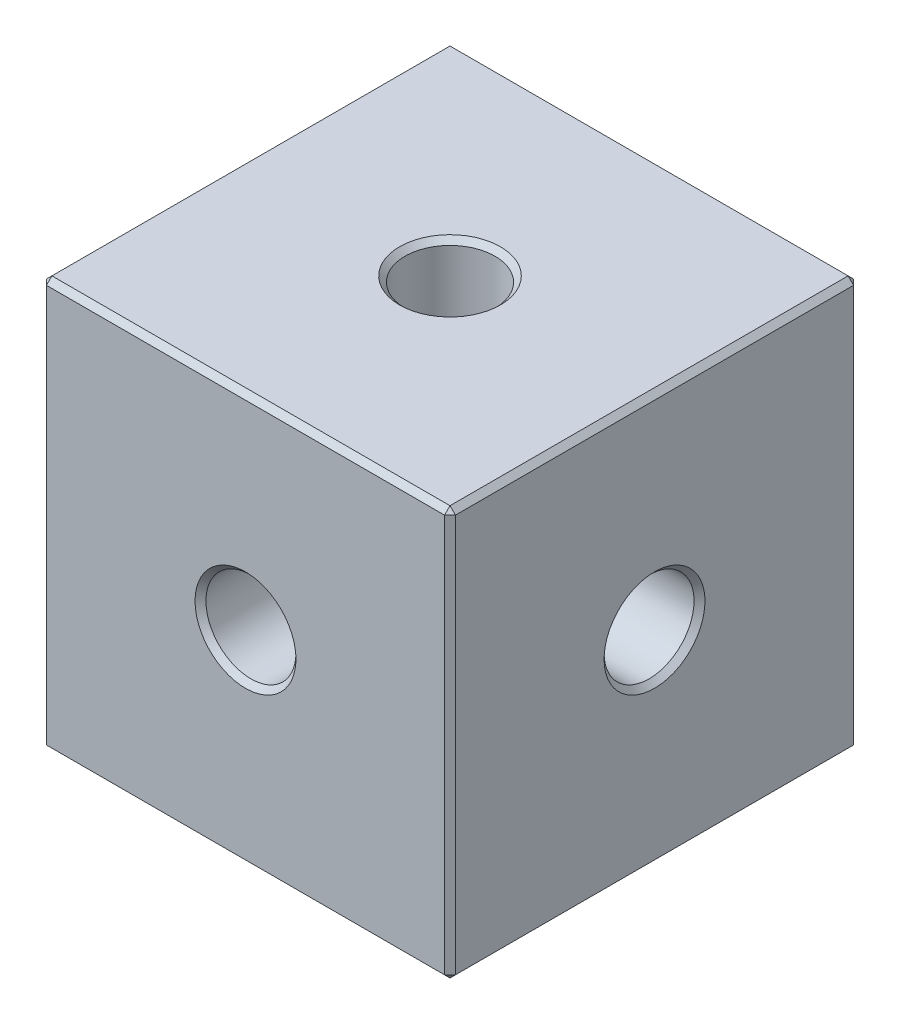
ISO-10303-21;
HEADER;
FILE_DESCRIPTION(('STEP AP214'),'2;1');
FILE_NAME('part.step','',(''),(''),'','','');
FILE_SCHEMA(('AUTOMOTIVE_DESIGN { 1 0 10303 214 1 1 1 1 }'));
ENDSEC;
DATA;
#1=APPLICATION_CONTEXT('core data for automotive mechanical design processes');
#2=APPLICATION_PROTOCOL_DEFINITION('international standard','automotive_design',2000,#1);
#3=PRODUCT_CONTEXT('',#1,'mechanical');
#4=PRODUCT('Part','Part','',(#3));
#5=PRODUCT_RELATED_PRODUCT_CATEGORY('part','',(#4));
#6=PRODUCT_DEFINITION_FORMATION('','',#4);
#7=PRODUCT_DEFINITION_CONTEXT('part definition',#1,'design');
#8=PRODUCT_DEFINITION('design','',#6,#7);
#9=PRODUCT_DEFINITION_SHAPE('','',#8);
#10=(LENGTH_UNIT() NAMED_UNIT(*) SI_UNIT(.MILLI.,.METRE.));
#11=(NAMED_UNIT(*) PLANE_ANGLE_UNIT() SI_UNIT($,.RADIAN.));
#12=(NAMED_UNIT(*) SI_UNIT($,.STERADIAN.) SOLID_ANGLE_UNIT());
#13=UNCERTAINTY_MEASURE_WITH_UNIT(LENGTH_MEASURE(1.E-05),#10,'distance_accuracy_value','');
#14=(GEOMETRIC_REPRESENTATION_CONTEXT(3) GLOBAL_UNCERTAINTY_ASSIGNED_CONTEXT((#13)) GLOBAL_UNIT_ASSIGNED_CONTEXT((#10,
#11,#12)) REPRESENTATION_CONTEXT('',''));
#15=CARTESIAN_POINT('',(0.,0.,0.));
#16=DIRECTION('',(0.,0.,1.));
#17=DIRECTION('',(1.,0.,0.));
#18=AXIS2_PLACEMENT_3D('',#15,#16,#17);
#19=CARTESIAN_POINT('',(0.,0.,7.5));
#20=DIRECTION('',(0.,0.,1.));
#21=DIRECTION('',(1.,0.,0.));
#22=AXIS2_PLACEMENT_3D('',#19,#20,#21);
#23=CYLINDRICAL_SURFACE('',#22,1.65);
#24=CARTESIAN_POINT('',(0.,0.,7.3));
#25=DIRECTION('',(0.,0.,-1.));
#26=DIRECTION('',(-1.,0.,0.));
#27=AXIS2_PLACEMENT_3D('',#24,#25,#26);
#28=CIRCLE('',#27,1.65);
#29=CARTESIAN_POINT('',(-1.65,0.,7.3));
#30=VERTEX_POINT('',#29);
#31=EDGE_CURVE('E251',#30,#30,#28,.F.);
#32=ORIENTED_EDGE('',*,*,#31,.T.);
#33=EDGE_LOOP('',(#32));
#34=FACE_BOUND('',#33,.T.);
#35=CARTESIAN_POINT('',(0.,0.,0.));
#36=DIRECTION('',(0.,0.707106781186547,0.707106781186547));
#37=DIRECTION('',(0.,-0.707106781186547,0.707106781186547));
#38=AXIS2_PLACEMENT_3D('',#35,#36,#37);
#39=ELLIPSE('',#38,2.3334523779156,1.65);
#40=CARTESIAN_POINT('',(1.1667261889578,-1.1667261889578,1.1667261889578));
#41=VERTEX_POINT('',#40);
#42=CARTESIAN_POINT('',(-1.1667261889578,-1.1667261889578,1.1667261889578));
#43=VERTEX_POINT('',#42);
#44=EDGE_CURVE('E167',#41,#43,#39,.F.);
#45=ORIENTED_EDGE('',*,*,#44,.T.);
#46=CARTESIAN_POINT('',(0.,0.,0.));
#47=DIRECTION('',(0.707106781186548,0.,0.707106781186547));
#48=DIRECTION('',(-0.707106781186547,0.,0.707106781186547));
#49=AXIS2_PLACEMENT_3D('',#46,#47,#48);
#50=ELLIPSE('',#49,2.3334523779156,1.65);
#51=CARTESIAN_POINT('',(-1.1667261889578,1.1667261889578,1.1667261889578));
#52=VERTEX_POINT('',#51);
#53=EDGE_CURVE('E161',#43,#52,#50,.F.);
#54=ORIENTED_EDGE('',*,*,#53,.T.);
#55=CARTESIAN_POINT('',(0.,0.,0.));
#56=DIRECTION('',(0.,-0.707106781186547,0.707106781186547));
#57=DIRECTION('',(0.,0.707106781186547,0.707106781186547));
#58=AXIS2_PLACEMENT_3D('',#55,#56,#57);
#59=ELLIPSE('',#58,2.3334523779156,1.65);
#60=CARTESIAN_POINT('',(1.1667261889578,1.1667261889578,1.1667261889578));
#61=VERTEX_POINT('',#60);
#62=EDGE_CURVE('E181',#52,#61,#59,.F.);
#63=ORIENTED_EDGE('',*,*,#62,.T.);
#64=CARTESIAN_POINT('',(0.,0.,0.));
#65=DIRECTION('',(-0.707106781186547,0.,0.707106781186547));
#66=DIRECTION('',(0.707106781186548,0.,0.707106781186547));
#67=AXIS2_PLACEMENT_3D('',#64,#65,#66);
#68=ELLIPSE('',#67,2.3334523779156,1.65);
#69=EDGE_CURVE('E618',#61,#41,#68,.F.);
#70=ORIENTED_EDGE('',*,*,#69,.T.);
#71=EDGE_LOOP('',(#45,#54,#63,#70));
#72=FACE_BOUND('',#71,.T.);
#73=ADVANCED_FACE('F41',(#34,#72),#23,.F.);
#74=CARTESIAN_POINT('',(7.5,7.5,-7.5));
#75=DIRECTION('',(-1.,0.,0.));
#76=DIRECTION('',(0.,0.,1.));
#77=AXIS2_PLACEMENT_3D('',#74,#75,#76);
#78=PLANE('',#77);
#79=CARTESIAN_POINT('',(7.5,0.,0.));
#80=DIRECTION('',(-1.,0.,0.));
#81=DIRECTION('',(0.,0.,1.));
#82=AXIS2_PLACEMENT_3D('',#79,#80,#81);
#83=CIRCLE('',#82,1.85);
#84=CARTESIAN_POINT('',(7.5,0.,1.85));
#85=VERTEX_POINT('',#84);
#86=EDGE_CURVE('E248',#85,#85,#83,.T.);
#87=ORIENTED_EDGE('',*,*,#86,.T.);
#88=EDGE_LOOP('',(#87));
#89=FACE_BOUND('',#88,.T.);
#90=DIRECTION('',(0.,0.,-1.));
#91=VECTOR('',#90,1.);
#92=CARTESIAN_POINT('',(7.5,-7.29999999999999,-7.5));
#93=LINE('',#92,#91);
#94=CARTESIAN_POINT('',(7.5,-7.29999999999999,7.29999999999999));
#95=VERTEX_POINT('',#94);
#96=CARTESIAN_POINT('',(7.5,-7.29999999999999,-7.29999999999999));
#97=VERTEX_POINT('',#96);
#98=EDGE_CURVE('E243',#95,#97,#93,.T.);
#99=ORIENTED_EDGE('',*,*,#98,.T.);
#100=DIRECTION('',(0.,1.,0.));
#101=VECTOR('',#100,1.);
#102=CARTESIAN_POINT('',(7.5,7.5,-7.29999999999999));
#103=LINE('',#102,#101);
#104=CARTESIAN_POINT('',(7.5,7.29999999999999,-7.29999999999999));
#105=VERTEX_POINT('',#104);
#106=EDGE_CURVE('E245',#97,#105,#103,.T.);
#107=ORIENTED_EDGE('',*,*,#106,.T.);
#108=DIRECTION('',(0.,0.,1.));
#109=VECTOR('',#108,1.);
#110=CARTESIAN_POINT('',(7.5,7.29999999999999,7.5));
#111=LINE('',#110,#109);
#112=CARTESIAN_POINT('',(7.5,7.29999999999999,7.29999999999999));
#113=VERTEX_POINT('',#112);
#114=EDGE_CURVE('E239',#105,#113,#111,.T.);
#115=ORIENTED_EDGE('',*,*,#114,.T.);
#116=DIRECTION('',(0.,-1.,0.));
#117=VECTOR('',#116,1.);
#118=CARTESIAN_POINT('',(7.5,7.5,7.29999999999999));
#119=LINE('',#118,#117);
#120=EDGE_CURVE('E241',#113,#95,#119,.T.);
#121=ORIENTED_EDGE('',*,*,#120,.T.);
#122=EDGE_LOOP('',(#99,#107,#115,#121));
#123=FACE_BOUND('',#122,.T.);
#124=ADVANCED_FACE('F352',(#89,#123),#78,.F.);
#125=CARTESIAN_POINT('',(-7.5,7.5,-7.5));
#126=DIRECTION('',(0.,0.,1.));
#127=DIRECTION('',(1.,0.,0.));
#128=AXIS2_PLACEMENT_3D('',#125,#126,#127);
#129=PLANE('',#128);
#130=CARTESIAN_POINT('',(0.,0.,-7.5));
#131=DIRECTION('',(0.,0.,1.));
#132=DIRECTION('',(1.,0.,0.));
#133=AXIS2_PLACEMENT_3D('',#130,#131,#132);
#134=CIRCLE('',#133,1.85);
#135=CARTESIAN_POINT('',(1.85,0.,-7.5));
#136=VERTEX_POINT('',#135);
#137=EDGE_CURVE('E230',#136,#136,#134,.T.);
#138=ORIENTED_EDGE('',*,*,#137,.T.);
#139=EDGE_LOOP('',(#138));
#140=FACE_BOUND('',#139,.T.);
#141=DIRECTION('',(-1.,0.,0.));
#142=VECTOR('',#141,1.);
#143=CARTESIAN_POINT('',(-7.5,-7.29999999999999,-7.5));
#144=LINE('',#143,#142);
#145=CARTESIAN_POINT('',(7.29999999999999,-7.29999999999999,-7.5));
#146=VERTEX_POINT('',#145);
#147=CARTESIAN_POINT('',(-7.3,-7.29999999999999,-7.5));
#148=VERTEX_POINT('',#147);
#149=EDGE_CURVE('E225',#146,#148,#144,.T.);
#150=ORIENTED_EDGE('',*,*,#149,.T.);
#151=DIRECTION('',(0.,1.,0.));
#152=VECTOR('',#151,1.);
#153=CARTESIAN_POINT('',(-7.3,7.5,-7.5));
#154=LINE('',#153,#152);
#155=CARTESIAN_POINT('',(-7.3,7.29999999999999,-7.5));
#156=VERTEX_POINT('',#155);
#157=EDGE_CURVE('E227',#148,#156,#154,.T.);
#158=ORIENTED_EDGE('',*,*,#157,.T.);
#159=DIRECTION('',(1.,0.,0.));
#160=VECTOR('',#159,1.);
#161=CARTESIAN_POINT('',(7.5,7.29999999999999,-7.5));
#162=LINE('',#161,#160);
#163=CARTESIAN_POINT('',(7.29999999999999,7.29999999999999,-7.5));
#164=VERTEX_POINT('',#163);
#165=EDGE_CURVE('E221',#156,#164,#162,.T.);
#166=ORIENTED_EDGE('',*,*,#165,.T.);
#167=DIRECTION('',(0.,-1.,0.));
#168=VECTOR('',#167,1.);
#169=CARTESIAN_POINT('',(7.29999999999999,7.5,-7.5));
#170=LINE('',#169,#168);
#171=EDGE_CURVE('E223',#164,#146,#170,.T.);
#172=ORIENTED_EDGE('',*,*,#171,.T.);
#173=EDGE_LOOP('',(#150,#158,#166,#172));
#174=FACE_BOUND('',#173,.T.);
#175=ADVANCED_FACE('F373',(#140,#174),#129,.F.);
#176=CARTESIAN_POINT('',(-7.5,7.5,-7.5));
#177=DIRECTION('',(1.,0.,0.));
#178=DIRECTION('',(0.,0.,-1.));
#179=AXIS2_PLACEMENT_3D('',#176,#177,#178);
#180=PLANE('',#179);
#181=CARTESIAN_POINT('',(-7.5,0.,0.));
#182=DIRECTION('',(1.,0.,0.));
#183=DIRECTION('',(0.,0.,-1.));
#184=AXIS2_PLACEMENT_3D('',#181,#182,#183);
#185=CIRCLE('',#184,1.84999999999999);
#186=CARTESIAN_POINT('',(-7.5,0.,-1.84999999999999));
#187=VERTEX_POINT('',#186);
#188=EDGE_CURVE('E215',#187,#187,#185,.T.);
#189=ORIENTED_EDGE('',*,*,#188,.T.);
#190=EDGE_LOOP('',(#189));
#191=FACE_BOUND('',#190,.T.);
#192=DIRECTION('',(0.,-1.,0.));
#193=VECTOR('',#192,1.);
#194=CARTESIAN_POINT('',(-7.5,7.5,-7.29999999999999));
#195=LINE('',#194,#193);
#196=CARTESIAN_POINT('',(-7.5,7.29999999999999,-7.29999999999999));
#197=VERTEX_POINT('',#196);
#198=CARTESIAN_POINT('',(-7.5,-7.29999999999999,-7.29999999999999));
#199=VERTEX_POINT('',#198);
#200=EDGE_CURVE('E210',#197,#199,#195,.T.);
#201=ORIENTED_EDGE('',*,*,#200,.T.);
#202=DIRECTION('',(0.,0.,1.));
#203=VECTOR('',#202,1.);
#204=CARTESIAN_POINT('',(-7.5,-7.29999999999999,-7.5));
#205=LINE('',#204,#203);
#206=CARTESIAN_POINT('',(-7.5,-7.29999999999999,7.29999999999999));
#207=VERTEX_POINT('',#206);
#208=EDGE_CURVE('E212',#199,#207,#205,.T.);
#209=ORIENTED_EDGE('',*,*,#208,.T.);
#210=DIRECTION('',(0.,1.,0.));
#211=VECTOR('',#210,1.);
#212=CARTESIAN_POINT('',(-7.5,7.5,7.29999999999999));
#213=LINE('',#212,#211);
#214=CARTESIAN_POINT('',(-7.5,7.29999999999999,7.29999999999999));
#215=VERTEX_POINT('',#214);
#216=EDGE_CURVE('E208',#207,#215,#213,.T.);
#217=ORIENTED_EDGE('',*,*,#216,.T.);
#218=DIRECTION('',(0.,0.,-1.));
#219=VECTOR('',#218,1.);
#220=CARTESIAN_POINT('',(-7.5,7.29999999999999,-7.5));
#221=LINE('',#220,#219);
#222=EDGE_CURVE('E206',#215,#197,#221,.T.);
#223=ORIENTED_EDGE('',*,*,#222,.T.);
#224=EDGE_LOOP('',(#201,#209,#217,#223));
#225=FACE_BOUND('',#224,.T.);
#226=ADVANCED_FACE('F434',(#191,#225),#180,.F.);
#227=CARTESIAN_POINT('',(-7.5,7.5,7.5));
#228=DIRECTION('',(0.,0.,-1.));
#229=DIRECTION('',(-1.,0.,0.));
#230=AXIS2_PLACEMENT_3D('',#227,#228,#229);
#231=PLANE('',#230);
#232=CARTESIAN_POINT('',(0.,0.,7.5));
#233=DIRECTION('',(0.,0.,-1.));
#234=DIRECTION('',(-1.,0.,0.));
#235=AXIS2_PLACEMENT_3D('',#232,#233,#234);
#236=CIRCLE('',#235,1.85);
#237=CARTESIAN_POINT('',(-1.85,0.,7.5));
#238=VERTEX_POINT('',#237);
#239=EDGE_CURVE('E263',#238,#238,#236,.T.);
#240=ORIENTED_EDGE('',*,*,#239,.T.);
#241=EDGE_LOOP('',(#240));
#242=FACE_BOUND('',#241,.T.);
#243=DIRECTION('',(-1.,0.,0.));
#244=VECTOR('',#243,1.);
#245=CARTESIAN_POINT('',(-7.5,7.29999999999999,7.5));
#246=LINE('',#245,#244);
#247=CARTESIAN_POINT('',(7.29999999999999,7.29999999999999,7.5));
#248=VERTEX_POINT('',#247);
#249=CARTESIAN_POINT('',(-7.29999999999999,7.29999999999999,7.5));
#250=VERTEX_POINT('',#249);
#251=EDGE_CURVE('E254',#248,#250,#246,.T.);
#252=ORIENTED_EDGE('',*,*,#251,.T.);
#253=DIRECTION('',(0.,-1.,0.));
#254=VECTOR('',#253,1.);
#255=CARTESIAN_POINT('',(-7.29999999999999,7.5,7.5));
#256=LINE('',#255,#254);
#257=CARTESIAN_POINT('',(-7.29999999999999,-7.29999999999999,7.5));
#258=VERTEX_POINT('',#257);
#259=EDGE_CURVE('E260',#250,#258,#256,.T.);
#260=ORIENTED_EDGE('',*,*,#259,.T.);
#261=DIRECTION('',(1.,0.,0.));
#262=VECTOR('',#261,1.);
#263=CARTESIAN_POINT('',(-7.5,-7.29999999999999,7.5));
#264=LINE('',#263,#262);
#265=CARTESIAN_POINT('',(7.29999999999999,-7.29999999999999,7.5));
#266=VERTEX_POINT('',#265);
#267=EDGE_CURVE('E258',#258,#266,#264,.T.);
#268=ORIENTED_EDGE('',*,*,#267,.T.);
#269=DIRECTION('',(0.,1.,0.));
#270=VECTOR('',#269,1.);
#271=CARTESIAN_POINT('',(7.29999999999999,7.5,7.5));
#272=LINE('',#271,#270);
#273=EDGE_CURVE('E256',#266,#248,#272,.T.);
#274=ORIENTED_EDGE('',*,*,#273,.T.);
#275=EDGE_LOOP('',(#252,#260,#268,#274));
#276=FACE_BOUND('',#275,.T.);
#277=ADVANCED_FACE('F439',(#242,#276),#231,.F.);
#278=CARTESIAN_POINT('',(0.,7.5,0.));
#279=DIRECTION('',(0.,1.,0.));
#280=DIRECTION('',(0.,0.,1.));
#281=AXIS2_PLACEMENT_3D('',#278,#279,#280);
#282=PLANE('',#281);
#283=DIRECTION('',(0.,0.,1.));
#284=VECTOR('',#283,1.);
#285=CARTESIAN_POINT('',(-7.29999999999999,7.5,7.5));
#286=LINE('',#285,#284);
#287=CARTESIAN_POINT('',(-7.3,7.5,-7.29999999999999));
#288=VERTEX_POINT('',#287);
#289=CARTESIAN_POINT('',(-7.29999999999999,7.5,7.29999999999999));
#290=VERTEX_POINT('',#289);
#291=EDGE_CURVE('E59',#288,#290,#286,.T.);
#292=ORIENTED_EDGE('',*,*,#291,.T.);
#293=DIRECTION('',(1.,0.,0.));
#294=VECTOR('',#293,1.);
#295=CARTESIAN_POINT('',(7.5,7.5,7.29999999999999));
#296=LINE('',#295,#294);
#297=CARTESIAN_POINT('',(7.29999999999999,7.5,7.29999999999999));
#298=VERTEX_POINT('',#297);
#299=EDGE_CURVE('E51',#290,#298,#296,.T.);
#300=ORIENTED_EDGE('',*,*,#299,.T.);
#301=DIRECTION('',(0.,0.,-1.));
#302=VECTOR('',#301,1.);
#303=CARTESIAN_POINT('',(7.29999999999999,7.5,-7.5));
#304=LINE('',#303,#302);
#305=CARTESIAN_POINT('',(7.29999999999999,7.5,-7.29999999999999));
#306=VERTEX_POINT('',#305);
#307=EDGE_CURVE('E269',#298,#306,#304,.T.);
#308=ORIENTED_EDGE('',*,*,#307,.T.);
#309=DIRECTION('',(-1.,0.,0.));
#310=VECTOR('',#309,1.);
#311=CARTESIAN_POINT('',(-7.5,7.5,-7.29999999999999));
#312=LINE('',#311,#310);
#313=EDGE_CURVE('E64',#306,#288,#312,.T.);
#314=ORIENTED_EDGE('',*,*,#313,.T.);
#315=EDGE_LOOP('',(#292,#300,#308,#314));
#316=FACE_BOUND('',#315,.T.);
#317=CARTESIAN_POINT('',(0.,7.5,0.));
#318=DIRECTION('',(0.,1.,0.));
#319=DIRECTION('',(0.,0.,1.));
#320=AXIS2_PLACEMENT_3D('',#317,#318,#319);
#321=CIRCLE('',#320,1.85);
#322=CARTESIAN_POINT('',(0.,7.5,1.85));
#323=VERTEX_POINT('',#322);
#324=EDGE_CURVE('E266',#323,#323,#321,.F.);
#325=ORIENTED_EDGE('',*,*,#324,.T.);
#326=EDGE_LOOP('',(#325));
#327=FACE_BOUND('',#326,.T.);
#328=ADVANCED_FACE('F420',(#316,#327),#282,.T.);
#329=CARTESIAN_POINT('',(0.,-7.5,0.));
#330=DIRECTION('',(0.,1.,0.));
#331=DIRECTION('',(0.,0.,1.));
#332=AXIS2_PLACEMENT_3D('',#329,#330,#331);
#333=PLANE('',#332);
#334=CARTESIAN_POINT('',(0.,-7.5,0.));
#335=DIRECTION('',(0.,1.,0.));
#336=DIRECTION('',(0.,0.,1.));
#337=AXIS2_PLACEMENT_3D('',#334,#335,#336);
#338=CIRCLE('',#337,1.85);
#339=CARTESIAN_POINT('',(0.,-7.5,1.85));
#340=VERTEX_POINT('',#339);
#341=EDGE_CURVE('E200',#340,#340,#338,.T.);
#342=ORIENTED_EDGE('',*,*,#341,.T.);
#343=EDGE_LOOP('',(#342));
#344=FACE_BOUND('',#343,.T.);
#345=DIRECTION('',(-1.,0.,0.));
#346=VECTOR('',#345,1.);
#347=CARTESIAN_POINT('',(0.,-7.5,7.29999999999999));
#348=LINE('',#347,#346);
#349=CARTESIAN_POINT('',(7.29999999999999,-7.5,7.29999999999999));
#350=VERTEX_POINT('',#349);
#351=CARTESIAN_POINT('',(-7.29999999999999,-7.5,7.29999999999999));
#352=VERTEX_POINT('',#351);
#353=EDGE_CURVE('E191',#350,#352,#348,.T.);
#354=ORIENTED_EDGE('',*,*,#353,.T.);
#355=DIRECTION('',(0.,0.,-1.));
#356=VECTOR('',#355,1.);
#357=CARTESIAN_POINT('',(-7.3,-7.5,0.));
#358=LINE('',#357,#356);
#359=CARTESIAN_POINT('',(-7.3,-7.5,-7.29999999999999));
#360=VERTEX_POINT('',#359);
#361=EDGE_CURVE('E197',#352,#360,#358,.T.);
#362=ORIENTED_EDGE('',*,*,#361,.T.);
#363=DIRECTION('',(1.,0.,0.));
#364=VECTOR('',#363,1.);
#365=CARTESIAN_POINT('',(0.,-7.5,-7.29999999999999));
#366=LINE('',#365,#364);
#367=CARTESIAN_POINT('',(7.29999999999999,-7.5,-7.29999999999999));
#368=VERTEX_POINT('',#367);
#369=EDGE_CURVE('E195',#360,#368,#366,.T.);
#370=ORIENTED_EDGE('',*,*,#369,.T.);
#371=DIRECTION('',(0.,0.,1.));
#372=VECTOR('',#371,1.);
#373=CARTESIAN_POINT('',(7.29999999999999,-7.5,0.));
#374=LINE('',#373,#372);
#375=EDGE_CURVE('E193',#368,#350,#374,.T.);
#376=ORIENTED_EDGE('',*,*,#375,.T.);
#377=EDGE_LOOP('',(#354,#362,#370,#376));
#378=FACE_BOUND('',#377,.T.);
#379=ADVANCED_FACE('F413',(#344,#378),#333,.F.);
#380=CARTESIAN_POINT('',(0.,0.,-7.3));
#381=DIRECTION('',(0.,0.,1.));
#382=DIRECTION('',(1.,0.,0.));
#383=AXIS2_PLACEMENT_3D('',#380,#381,#382);
#384=CIRCLE('',#383,1.65);
#385=CARTESIAN_POINT('',(1.65,0.,-7.3));
#386=VERTEX_POINT('',#385);
#387=EDGE_CURVE('E233',#386,#386,#384,.F.);
#388=ORIENTED_EDGE('',*,*,#387,.T.);
#389=EDGE_LOOP('',(#388));
#390=FACE_BOUND('',#389,.T.);
#391=CARTESIAN_POINT('',(0.,0.,0.));
#392=DIRECTION('',(0.,-0.707106781186547,0.707106781186547));
#393=DIRECTION('',(0.,0.707106781186547,0.707106781186547));
#394=AXIS2_PLACEMENT_3D('',#391,#392,#393);
#395=ELLIPSE('',#394,2.3334523779156,1.65);
#396=CARTESIAN_POINT('',(-1.1667261889578,-1.1667261889578,-1.1667261889578));
#397=VERTEX_POINT('',#396);
#398=CARTESIAN_POINT('',(1.1667261889578,-1.1667261889578,-1.1667261889578));
#399=VERTEX_POINT('',#398);
#400=EDGE_CURVE('E174',#397,#399,#395,.T.);
#401=ORIENTED_EDGE('',*,*,#400,.T.);
#402=CARTESIAN_POINT('',(0.,0.,0.));
#403=DIRECTION('',(0.707106781186548,0.,0.707106781186547));
#404=DIRECTION('',(-0.707106781186547,0.,0.707106781186547));
#405=AXIS2_PLACEMENT_3D('',#402,#403,#404);
#406=ELLIPSE('',#405,2.3334523779156,1.65);
#407=CARTESIAN_POINT('',(1.1667261889578,1.1667261889578,-1.1667261889578));
#408=VERTEX_POINT('',#407);
#409=EDGE_CURVE('E619',#399,#408,#406,.T.);
#410=ORIENTED_EDGE('',*,*,#409,.T.);
#411=CARTESIAN_POINT('',(0.,0.,0.));
#412=DIRECTION('',(0.,0.707106781186547,0.707106781186547));
#413=DIRECTION('',(0.,-0.707106781186547,0.707106781186547));
#414=AXIS2_PLACEMENT_3D('',#411,#412,#413);
#415=ELLIPSE('',#414,2.3334523779156,1.65);
#416=CARTESIAN_POINT('',(-1.1667261889578,1.1667261889578,-1.1667261889578));
#417=VERTEX_POINT('',#416);
#418=EDGE_CURVE('E176',#408,#417,#415,.T.);
#419=ORIENTED_EDGE('',*,*,#418,.T.);
#420=CARTESIAN_POINT('',(0.,0.,0.));
#421=DIRECTION('',(-0.707106781186547,0.,0.707106781186547));
#422=DIRECTION('',(0.707106781186548,0.,0.707106781186547));
#423=AXIS2_PLACEMENT_3D('',#420,#421,#422);
#424=ELLIPSE('',#423,2.3334523779156,1.65);
#425=EDGE_CURVE('E158',#417,#397,#424,.T.);
#426=ORIENTED_EDGE('',*,*,#425,.T.);
#427=EDGE_LOOP('',(#401,#410,#419,#426));
#428=FACE_BOUND('',#427,.T.);
#429=ADVANCED_FACE('F172',(#390,#428),#23,.F.);
#430=CARTESIAN_POINT('',(0.,7.5,0.));
#431=DIRECTION('',(0.,1.,0.));
#432=DIRECTION('',(0.,0.,1.));
#433=AXIS2_PLACEMENT_3D('',#430,#431,#432);
#434=CYLINDRICAL_SURFACE('',#433,1.65);
#435=CARTESIAN_POINT('',(0.,7.3,0.));
#436=DIRECTION('',(0.,1.,0.));
#437=DIRECTION('',(0.,0.,1.));
#438=AXIS2_PLACEMENT_3D('',#435,#436,#437);
#439=CIRCLE('',#438,1.65);
#440=CARTESIAN_POINT('',(0.,7.3,1.65));
#441=VERTEX_POINT('',#440);
#442=EDGE_CURVE('E11',#441,#441,#439,.T.);
#443=ORIENTED_EDGE('',*,*,#442,.T.);
#444=EDGE_LOOP('',(#443));
#445=FACE_BOUND('',#444,.T.);
#446=ORIENTED_EDGE('',*,*,#62,.F.);
#447=CARTESIAN_POINT('',(0.,0.,0.));
#448=DIRECTION('',(0.707106781186547,0.707106781186547,0.));
#449=DIRECTION('',(-0.707106781186547,0.707106781186547,0.));
#450=AXIS2_PLACEMENT_3D('',#447,#448,#449);
#451=ELLIPSE('',#450,2.3334523779156,1.65);
#452=EDGE_CURVE('E177',#52,#417,#451,.F.);
#453=ORIENTED_EDGE('',*,*,#452,.T.);
#454=ORIENTED_EDGE('',*,*,#418,.F.);
#455=CARTESIAN_POINT('',(0.,0.,0.));
#456=DIRECTION('',(-0.707106781186547,0.707106781186547,0.));
#457=DIRECTION('',(0.707106781186547,0.707106781186547,0.));
#458=AXIS2_PLACEMENT_3D('',#455,#456,#457);
#459=ELLIPSE('',#458,2.3334523779156,1.65);
#460=EDGE_CURVE('E185',#408,#61,#459,.F.);
#461=ORIENTED_EDGE('',*,*,#460,.T.);
#462=EDGE_LOOP('',(#446,#453,#454,#461));
#463=FACE_BOUND('',#462,.T.);
#464=ADVANCED_FACE('F412',(#445,#463),#434,.F.);
#465=CARTESIAN_POINT('',(0.,-7.3,0.));
#466=DIRECTION('',(0.,1.,0.));
#467=DIRECTION('',(0.,0.,1.));
#468=AXIS2_PLACEMENT_3D('',#465,#466,#467);
#469=CIRCLE('',#468,1.65);
#470=CARTESIAN_POINT('',(0.,-7.3,1.65));
#471=VERTEX_POINT('',#470);
#472=EDGE_CURVE('E203',#471,#471,#469,.F.);
#473=ORIENTED_EDGE('',*,*,#472,.T.);
#474=EDGE_LOOP('',(#473));
#475=FACE_BOUND('',#474,.T.);
#476=ORIENTED_EDGE('',*,*,#44,.F.);
#477=CARTESIAN_POINT('',(0.,0.,0.));
#478=DIRECTION('',(0.707106781186547,0.707106781186547,0.));
#479=DIRECTION('',(-0.707106781186547,0.707106781186547,0.));
#480=AXIS2_PLACEMENT_3D('',#477,#478,#479);
#481=ELLIPSE('',#480,2.3334523779156,1.65);
#482=EDGE_CURVE('E166',#41,#399,#481,.T.);
#483=ORIENTED_EDGE('',*,*,#482,.T.);
#484=ORIENTED_EDGE('',*,*,#400,.F.);
#485=CARTESIAN_POINT('',(0.,0.,0.));
#486=DIRECTION('',(-0.707106781186547,0.707106781186547,0.));
#487=DIRECTION('',(0.707106781186547,0.707106781186547,0.));
#488=AXIS2_PLACEMENT_3D('',#485,#486,#487);
#489=ELLIPSE('',#488,2.3334523779156,1.65);
#490=EDGE_CURVE('E155',#397,#43,#489,.T.);
#491=ORIENTED_EDGE('',*,*,#490,.T.);
#492=EDGE_LOOP('',(#476,#483,#484,#491));
#493=FACE_BOUND('',#492,.T.);
#494=ADVANCED_FACE('F180',(#475,#493),#434,.F.);
#495=CARTESIAN_POINT('',(7.5,0.,0.));
#496=DIRECTION('',(1.,0.,0.));
#497=DIRECTION('',(0.,0.,-1.));
#498=AXIS2_PLACEMENT_3D('',#495,#496,#497);
#499=CYLINDRICAL_SURFACE('',#498,1.65);
#500=CARTESIAN_POINT('',(-7.30000000000001,0.,0.));
#501=DIRECTION('',(1.,0.,0.));
#502=DIRECTION('',(0.,0.,-1.));
#503=AXIS2_PLACEMENT_3D('',#500,#501,#502);
#504=CIRCLE('',#503,1.65);
#505=CARTESIAN_POINT('',(-7.30000000000001,0.,-1.65));
#506=VERTEX_POINT('',#505);
#507=EDGE_CURVE('E218',#506,#506,#504,.F.);
#508=ORIENTED_EDGE('',*,*,#507,.T.);
#509=EDGE_LOOP('',(#508));
#510=FACE_BOUND('',#509,.T.);
#511=ORIENTED_EDGE('',*,*,#490,.F.);
#512=ORIENTED_EDGE('',*,*,#425,.F.);
#513=ORIENTED_EDGE('',*,*,#452,.F.);
#514=ORIENTED_EDGE('',*,*,#53,.F.);
#515=EDGE_LOOP('',(#511,#512,#513,#514));
#516=FACE_BOUND('',#515,.T.);
#517=ADVANCED_FACE('F157',(#510,#516),#499,.F.);
#518=CARTESIAN_POINT('',(7.3,0.,0.));
#519=DIRECTION('',(-1.,0.,0.));
#520=DIRECTION('',(0.,0.,1.));
#521=AXIS2_PLACEMENT_3D('',#518,#519,#520);
#522=CIRCLE('',#521,1.65);
#523=CARTESIAN_POINT('',(7.3,0.,1.65));
#524=VERTEX_POINT('',#523);
#525=EDGE_CURVE('E236',#524,#524,#522,.F.);
#526=ORIENTED_EDGE('',*,*,#525,.T.);
#527=EDGE_LOOP('',(#526));
#528=FACE_BOUND('',#527,.T.);
#529=ORIENTED_EDGE('',*,*,#409,.F.);
#530=ORIENTED_EDGE('',*,*,#482,.F.);
#531=ORIENTED_EDGE('',*,*,#69,.F.);
#532=ORIENTED_EDGE('',*,*,#460,.F.);
#533=EDGE_LOOP('',(#529,#530,#531,#532));
#534=FACE_BOUND('',#533,.T.);
#535=ADVANCED_FACE('F451',(#528,#534),#499,.F.);
#536=CARTESIAN_POINT('',(0.,-7.5,0.));
#537=DIRECTION('',(0.,-1.,0.));
#538=DIRECTION('',(0.,0.,-1.));
#539=AXIS2_PLACEMENT_3D('',#536,#537,#538);
#540=CONICAL_SURFACE('',#539,1.85,0.785398163397451);
#541=ORIENTED_EDGE('',*,*,#472,.F.);
#542=EDGE_LOOP('',(#541));
#543=FACE_BOUND('',#542,.T.);
#544=ORIENTED_EDGE('',*,*,#341,.F.);
#545=EDGE_LOOP('',(#544));
#546=FACE_BOUND('',#545,.T.);
#547=ADVANCED_FACE('F445',(#543,#546),#540,.F.);
#548=CARTESIAN_POINT('',(-7.5,0.,0.));
#549=DIRECTION('',(-1.,0.,0.));
#550=DIRECTION('',(0.,0.,1.));
#551=AXIS2_PLACEMENT_3D('',#548,#549,#550);
#552=CONICAL_SURFACE('',#551,1.84999999999999,0.78539816339745);
#553=ORIENTED_EDGE('',*,*,#507,.F.);
#554=EDGE_LOOP('',(#553));
#555=FACE_BOUND('',#554,.T.);
#556=ORIENTED_EDGE('',*,*,#188,.F.);
#557=EDGE_LOOP('',(#556));
#558=FACE_BOUND('',#557,.T.);
#559=ADVANCED_FACE('F429',(#555,#558),#552,.F.);
#560=CARTESIAN_POINT('',(0.,0.,-7.5));
#561=DIRECTION('',(0.,0.,-1.));
#562=DIRECTION('',(-1.,0.,0.));
#563=AXIS2_PLACEMENT_3D('',#560,#561,#562);
#564=CONICAL_SURFACE('',#563,1.85,0.785398163397451);
#565=ORIENTED_EDGE('',*,*,#387,.F.);
#566=EDGE_LOOP('',(#565));
#567=FACE_BOUND('',#566,.T.);
#568=ORIENTED_EDGE('',*,*,#137,.F.);
#569=EDGE_LOOP('',(#568));
#570=FACE_BOUND('',#569,.T.);
#571=ADVANCED_FACE('F425',(#567,#570),#564,.F.);
#572=CARTESIAN_POINT('',(7.3,0.,0.));
#573=DIRECTION('',(1.,0.,0.));
#574=DIRECTION('',(0.,0.,-1.));
#575=AXIS2_PLACEMENT_3D('',#572,#573,#574);
#576=CONICAL_SURFACE('',#575,1.65,0.785398163397461);
#577=ORIENTED_EDGE('',*,*,#86,.F.);
#578=EDGE_LOOP('',(#577));
#579=FACE_BOUND('',#578,.T.);
#580=ORIENTED_EDGE('',*,*,#525,.F.);
#581=EDGE_LOOP('',(#580));
#582=FACE_BOUND('',#581,.T.);
#583=ADVANCED_FACE('F428',(#579,#582),#576,.F.);
#584=CARTESIAN_POINT('',(0.,0.,7.3));
#585=DIRECTION('',(0.,0.,1.));
#586=DIRECTION('',(1.,0.,0.));
#587=AXIS2_PLACEMENT_3D('',#584,#585,#586);
#588=CONICAL_SURFACE('',#587,1.65,0.78539816339746);
#589=ORIENTED_EDGE('',*,*,#239,.F.);
#590=EDGE_LOOP('',(#589));
#591=FACE_BOUND('',#590,.T.);
#592=ORIENTED_EDGE('',*,*,#31,.F.);
#593=EDGE_LOOP('',(#592));
#594=FACE_BOUND('',#593,.T.);
#595=ADVANCED_FACE('F467',(#591,#594),#588,.F.);
#596=CARTESIAN_POINT('',(7.29999999999999,7.5,0.));
#597=DIRECTION('',(0.707106781186548,0.707106781186548,0.));
#598=DIRECTION('',(0.,0.,1.));
#599=AXIS2_PLACEMENT_3D('',#596,#597,#598);
#600=PLANE('',#599);
#601=DIRECTION('',(0.707106781186547,-0.707106781186547,0.));
#602=VECTOR('',#601,1.);
#603=CARTESIAN_POINT('',(7.5,7.29999999999999,-7.29999999999999));
#604=LINE('',#603,#602);
#605=EDGE_CURVE('E46',#306,#105,#604,.T.);
#606=ORIENTED_EDGE('',*,*,#605,.F.);
#607=ORIENTED_EDGE('',*,*,#307,.F.);
#608=DIRECTION('',(-0.707106781186547,0.707106781186547,0.));
#609=VECTOR('',#608,1.);
#610=CARTESIAN_POINT('',(7.4,7.4,7.29999999999999));
#611=LINE('',#610,#609);
#612=EDGE_CURVE('E333',#113,#298,#611,.T.);
#613=ORIENTED_EDGE('',*,*,#612,.F.);
#614=ORIENTED_EDGE('',*,*,#114,.F.);
#615=EDGE_LOOP('',(#606,#607,#613,#614));
#616=FACE_BOUND('',#615,.T.);
#617=ADVANCED_FACE('F349',(#616),#600,.T.);
#618=CARTESIAN_POINT('',(7.5,7.29999999999999,-7.29999999999999));
#619=DIRECTION('',(0.577350269189625,0.577350269189625,-0.577350269189628));
#620=DIRECTION('',(-0.707106781186549,0.,-0.707106781186546));
#621=AXIS2_PLACEMENT_3D('',#618,#619,#620);
#622=PLANE('',#621);
#623=DIRECTION('',(0.,0.707106781186548,0.707106781186548));
#624=VECTOR('',#623,1.);
#625=CARTESIAN_POINT('',(7.29999999999999,7.4,-7.4));
#626=LINE('',#625,#624);
#627=EDGE_CURVE('E329',#306,#164,#626,.F.);
#628=ORIENTED_EDGE('',*,*,#627,.F.);
#629=ORIENTED_EDGE('',*,*,#605,.T.);
#630=DIRECTION('',(0.707106781186549,0.,0.707106781186546));
#631=VECTOR('',#630,1.);
#632=CARTESIAN_POINT('',(7.5,7.29999999999999,-7.29999999999999));
#633=LINE('',#632,#631);
#634=EDGE_CURVE('E332',#164,#105,#633,.T.);
#635=ORIENTED_EDGE('',*,*,#634,.F.);
#636=EDGE_LOOP('',(#628,#629,#635));
#637=FACE_BOUND('',#636,.T.);
#638=ADVANCED_FACE('F346',(#637),#622,.T.);
#639=CARTESIAN_POINT('',(7.29999999999999,7.29999999999999,7.5));
#640=DIRECTION('',(0.577350269189627,0.577350269189627,0.577350269189624));
#641=DIRECTION('',(-0.707106781186547,0.707106781186547,0.));
#642=AXIS2_PLACEMENT_3D('',#639,#640,#641);
#643=PLANE('',#642);
#644=DIRECTION('',(-0.707106781186546,0.,0.707106781186549));
#645=VECTOR('',#644,1.);
#646=CARTESIAN_POINT('',(7.29999999999999,7.29999999999999,7.5));
#647=LINE('',#646,#645);
#648=EDGE_CURVE('E324',#113,#248,#647,.T.);
#649=ORIENTED_EDGE('',*,*,#648,.F.);
#650=ORIENTED_EDGE('',*,*,#612,.T.);
#651=DIRECTION('',(0.,-0.707106781186548,0.707106781186548));
#652=VECTOR('',#651,1.);
#653=CARTESIAN_POINT('',(7.29999999999999,7.29999999999999,7.5));
#654=LINE('',#653,#652);
#655=EDGE_CURVE('E327',#248,#298,#654,.F.);
#656=ORIENTED_EDGE('',*,*,#655,.F.);
#657=EDGE_LOOP('',(#649,#650,#656));
#658=FACE_BOUND('',#657,.T.);
#659=ADVANCED_FACE('F397',(#658),#643,.T.);
#660=CARTESIAN_POINT('',(7.29999999999999,7.5,-7.5));
#661=DIRECTION('',(-0.707106781186546,0.,0.707106781186549));
#662=DIRECTION('',(0.,-1.,0.));
#663=AXIS2_PLACEMENT_3D('',#660,#661,#662);
#664=PLANE('',#663);
#665=ORIENTED_EDGE('',*,*,#634,.T.);
#666=ORIENTED_EDGE('',*,*,#106,.F.);
#667=DIRECTION('',(-0.707106781186549,0.,-0.707106781186546));
#668=VECTOR('',#667,1.);
#669=CARTESIAN_POINT('',(7.4,-7.29999999999999,-7.4));
#670=LINE('',#669,#668);
#671=EDGE_CURVE('E318',#146,#97,#670,.F.);
#672=ORIENTED_EDGE('',*,*,#671,.F.);
#673=ORIENTED_EDGE('',*,*,#171,.F.);
#674=EDGE_LOOP('',(#665,#666,#672,#673));
#675=FACE_BOUND('',#674,.T.);
#676=ADVANCED_FACE('F357',(#675),#664,.F.);
#677=CARTESIAN_POINT('',(0.,7.5,-7.29999999999999));
#678=DIRECTION('',(0.,0.707106781186548,-0.707106781186548));
#679=DIRECTION('',(1.,0.,0.));
#680=AXIS2_PLACEMENT_3D('',#677,#678,#679);
#681=PLANE('',#680);
#682=ORIENTED_EDGE('',*,*,#627,.T.);
#683=ORIENTED_EDGE('',*,*,#165,.F.);
#684=DIRECTION('',(0.,-0.707106781186548,-0.707106781186548));
#685=VECTOR('',#684,1.);
#686=CARTESIAN_POINT('',(-7.3,7.29999999999999,-7.5));
#687=LINE('',#686,#685);
#688=EDGE_CURVE('E315',#288,#156,#687,.T.);
#689=ORIENTED_EDGE('',*,*,#688,.F.);
#690=ORIENTED_EDGE('',*,*,#313,.F.);
#691=EDGE_LOOP('',(#682,#683,#689,#690));
#692=FACE_BOUND('',#691,.T.);
#693=ADVANCED_FACE('F386',(#692),#681,.T.);
#694=CARTESIAN_POINT('',(-7.3,7.5,0.));
#695=DIRECTION('',(-0.707106781186548,0.707106781186548,0.));
#696=DIRECTION('',(0.,0.,-1.));
#697=AXIS2_PLACEMENT_3D('',#694,#695,#696);
#698=PLANE('',#697);
#699=DIRECTION('',(-0.707106781186547,-0.707106781186547,0.));
#700=VECTOR('',#699,1.);
#701=CARTESIAN_POINT('',(-7.5,7.29999999999999,7.29999999999999));
#702=LINE('',#701,#700);
#703=EDGE_CURVE('E309',#290,#215,#702,.T.);
#704=ORIENTED_EDGE('',*,*,#703,.F.);
#705=ORIENTED_EDGE('',*,*,#291,.F.);
#706=DIRECTION('',(0.707106781186547,0.707106781186547,0.));
#707=VECTOR('',#706,1.);
#708=CARTESIAN_POINT('',(-7.4,7.4,-7.29999999999999));
#709=LINE('',#708,#707);
#710=EDGE_CURVE('E312',#197,#288,#709,.T.);
#711=ORIENTED_EDGE('',*,*,#710,.F.);
#712=ORIENTED_EDGE('',*,*,#222,.F.);
#713=EDGE_LOOP('',(#704,#705,#711,#712));
#714=FACE_BOUND('',#713,.T.);
#715=ADVANCED_FACE('F388',(#714),#698,.T.);
#716=CARTESIAN_POINT('',(0.,7.5,7.29999999999999));
#717=DIRECTION('',(0.,0.707106781186548,0.707106781186548));
#718=DIRECTION('',(-1.,0.,0.));
#719=AXIS2_PLACEMENT_3D('',#716,#717,#718);
#720=PLANE('',#719);
#721=ORIENTED_EDGE('',*,*,#655,.T.);
#722=ORIENTED_EDGE('',*,*,#299,.F.);
#723=DIRECTION('',(0.,0.707106781186548,-0.707106781186548));
#724=VECTOR('',#723,1.);
#725=CARTESIAN_POINT('',(-7.29999999999999,7.4,7.4));
#726=LINE('',#725,#724);
#727=EDGE_CURVE('E306',#250,#290,#726,.T.);
#728=ORIENTED_EDGE('',*,*,#727,.F.);
#729=ORIENTED_EDGE('',*,*,#251,.F.);
#730=EDGE_LOOP('',(#721,#722,#728,#729));
#731=FACE_BOUND('',#730,.T.);
#732=ADVANCED_FACE('F394',(#731),#720,.T.);
#733=CARTESIAN_POINT('',(7.5,7.5,7.29999999999999));
#734=DIRECTION('',(-0.707106781186549,0.,-0.707106781186546));
#735=DIRECTION('',(0.,-1.,0.));
#736=AXIS2_PLACEMENT_3D('',#733,#734,#735);
#737=PLANE('',#736);
#738=ORIENTED_EDGE('',*,*,#648,.T.);
#739=ORIENTED_EDGE('',*,*,#273,.F.);
#740=DIRECTION('',(0.707106781186546,0.,-0.707106781186549));
#741=VECTOR('',#740,1.);
#742=CARTESIAN_POINT('',(7.4,-7.29999999999999,7.4));
#743=LINE('',#742,#741);
#744=EDGE_CURVE('E303',#95,#266,#743,.F.);
#745=ORIENTED_EDGE('',*,*,#744,.F.);
#746=ORIENTED_EDGE('',*,*,#120,.F.);
#747=EDGE_LOOP('',(#738,#739,#745,#746));
#748=FACE_BOUND('',#747,.T.);
#749=ADVANCED_FACE('F550',(#748),#737,.F.);
#750=CARTESIAN_POINT('',(7.5,-7.29999999999999,-7.5));
#751=DIRECTION('',(-0.707106781186548,0.707106781186548,0.));
#752=DIRECTION('',(0.,0.,-1.));
#753=AXIS2_PLACEMENT_3D('',#750,#751,#752);
#754=PLANE('',#753);
#755=DIRECTION('',(0.707106781186547,0.707106781186547,0.));
#756=VECTOR('',#755,1.);
#757=CARTESIAN_POINT('',(7.29999999999999,-7.5,-7.29999999999999));
#758=LINE('',#757,#756);
#759=EDGE_CURVE('E321',#97,#368,#758,.F.);
#760=ORIENTED_EDGE('',*,*,#759,.F.);
#761=ORIENTED_EDGE('',*,*,#98,.F.);
#762=DIRECTION('',(-0.707106781186547,-0.707106781186547,0.));
#763=VECTOR('',#762,1.);
#764=CARTESIAN_POINT('',(7.29999999999999,-7.5,7.29999999999999));
#765=LINE('',#764,#763);
#766=EDGE_CURVE('E300',#350,#95,#765,.F.);
#767=ORIENTED_EDGE('',*,*,#766,.F.);
#768=ORIENTED_EDGE('',*,*,#375,.F.);
#769=EDGE_LOOP('',(#760,#761,#767,#768));
#770=FACE_BOUND('',#769,.T.);
#771=ADVANCED_FACE('F361',(#770),#754,.F.);
#772=CARTESIAN_POINT('',(7.29999999999999,-7.5,-7.29999999999999));
#773=DIRECTION('',(0.577350269189625,-0.577350269189625,-0.577350269189628));
#774=DIRECTION('',(-0.707106781186549,0.,-0.707106781186546));
#775=AXIS2_PLACEMENT_3D('',#772,#773,#774);
#776=PLANE('',#775);
#777=ORIENTED_EDGE('',*,*,#671,.T.);
#778=ORIENTED_EDGE('',*,*,#759,.T.);
#779=DIRECTION('',(0.,-0.707106781186548,0.707106781186548));
#780=VECTOR('',#779,1.);
#781=CARTESIAN_POINT('',(7.29999999999999,-7.5,-7.29999999999999));
#782=LINE('',#781,#780);
#783=EDGE_CURVE('E297',#146,#368,#782,.T.);
#784=ORIENTED_EDGE('',*,*,#783,.F.);
#785=EDGE_LOOP('',(#777,#778,#784));
#786=FACE_BOUND('',#785,.T.);
#787=ADVANCED_FACE('F365',(#786),#776,.T.);
#788=CARTESIAN_POINT('',(-7.3,7.29999999999999,-7.5));
#789=DIRECTION('',(-0.577350269189626,0.577350269189626,-0.577350269189626));
#790=DIRECTION('',(-0.707106781186547,0.,0.707106781186547));
#791=AXIS2_PLACEMENT_3D('',#788,#789,#790);
#792=PLANE('',#791);
#793=ORIENTED_EDGE('',*,*,#710,.T.);
#794=ORIENTED_EDGE('',*,*,#688,.T.);
#795=DIRECTION('',(0.707106781186548,0.,-0.707106781186548));
#796=VECTOR('',#795,1.);
#797=CARTESIAN_POINT('',(-7.3,7.29999999999999,-7.5));
#798=LINE('',#797,#796);
#799=EDGE_CURVE('E295',#197,#156,#798,.T.);
#800=ORIENTED_EDGE('',*,*,#799,.F.);
#801=EDGE_LOOP('',(#793,#794,#800));
#802=FACE_BOUND('',#801,.T.);
#803=ADVANCED_FACE('F383',(#802),#792,.T.);
#804=CARTESIAN_POINT('',(-7.5,7.29999999999999,7.29999999999999));
#805=DIRECTION('',(-0.577350269189626,0.577350269189626,0.577350269189626));
#806=DIRECTION('',(0.707106781186547,0.,0.707106781186547));
#807=AXIS2_PLACEMENT_3D('',#804,#805,#806);
#808=PLANE('',#807);
#809=ORIENTED_EDGE('',*,*,#727,.T.);
#810=ORIENTED_EDGE('',*,*,#703,.T.);
#811=DIRECTION('',(-0.707106781186548,0.,-0.707106781186548));
#812=VECTOR('',#811,1.);
#813=CARTESIAN_POINT('',(-7.5,7.29999999999999,7.29999999999999));
#814=LINE('',#813,#812);
#815=EDGE_CURVE('E292',#250,#215,#814,.T.);
#816=ORIENTED_EDGE('',*,*,#815,.F.);
#817=EDGE_LOOP('',(#809,#810,#816));
#818=FACE_BOUND('',#817,.T.);
#819=ADVANCED_FACE('F527',(#818),#808,.T.);
#820=CARTESIAN_POINT('',(7.29999999999999,-7.5,7.29999999999999));
#821=DIRECTION('',(0.577350269189627,-0.577350269189627,0.577350269189624));
#822=DIRECTION('',(0.707106781186547,0.707106781186547,0.));
#823=AXIS2_PLACEMENT_3D('',#820,#821,#822);
#824=PLANE('',#823);
#825=ORIENTED_EDGE('',*,*,#766,.T.);
#826=ORIENTED_EDGE('',*,*,#744,.T.);
#827=DIRECTION('',(0.,0.707106781186548,0.707106781186548));
#828=VECTOR('',#827,1.);
#829=CARTESIAN_POINT('',(7.29999999999999,-7.5,7.29999999999999));
#830=LINE('',#829,#828);
#831=EDGE_CURVE('E289',#350,#266,#830,.T.);
#832=ORIENTED_EDGE('',*,*,#831,.F.);
#833=EDGE_LOOP('',(#825,#826,#832));
#834=FACE_BOUND('',#833,.T.);
#835=ADVANCED_FACE('F521',(#834),#824,.T.);
#836=CARTESIAN_POINT('',(-7.5,-7.29999999999999,-7.5));
#837=DIRECTION('',(0.,0.707106781186548,0.707106781186548));
#838=DIRECTION('',(-1.,0.,0.));
#839=AXIS2_PLACEMENT_3D('',#836,#837,#838);
#840=PLANE('',#839);
#841=ORIENTED_EDGE('',*,*,#783,.T.);
#842=ORIENTED_EDGE('',*,*,#369,.F.);
#843=DIRECTION('',(0.,0.707106781186548,-0.707106781186548));
#844=VECTOR('',#843,1.);
#845=CARTESIAN_POINT('',(-7.3,-7.5,-7.29999999999999));
#846=LINE('',#845,#844);
#847=EDGE_CURVE('E286',#148,#360,#846,.F.);
#848=ORIENTED_EDGE('',*,*,#847,.F.);
#849=ORIENTED_EDGE('',*,*,#149,.F.);
#850=EDGE_LOOP('',(#841,#842,#848,#849));
#851=FACE_BOUND('',#850,.T.);
#852=ADVANCED_FACE('F370',(#851),#840,.F.);
#853=CARTESIAN_POINT('',(-7.5,7.5,-7.29999999999999));
#854=DIRECTION('',(0.707106781186548,0.,0.707106781186548));
#855=DIRECTION('',(0.,-1.,0.));
#856=AXIS2_PLACEMENT_3D('',#853,#854,#855);
#857=PLANE('',#856);
#858=ORIENTED_EDGE('',*,*,#799,.T.);
#859=ORIENTED_EDGE('',*,*,#157,.F.);
#860=DIRECTION('',(-0.707106781186548,0.,0.707106781186548));
#861=VECTOR('',#860,1.);
#862=CARTESIAN_POINT('',(-7.4,-7.29999999999999,-7.4));
#863=LINE('',#862,#861);
#864=EDGE_CURVE('E283',#199,#148,#863,.F.);
#865=ORIENTED_EDGE('',*,*,#864,.F.);
#866=ORIENTED_EDGE('',*,*,#200,.F.);
#867=EDGE_LOOP('',(#858,#859,#865,#866));
#868=FACE_BOUND('',#867,.T.);
#869=ADVANCED_FACE('F376',(#868),#857,.F.);
#870=CARTESIAN_POINT('',(-7.29999999999999,7.5,7.5));
#871=DIRECTION('',(0.707106781186548,0.,-0.707106781186548));
#872=DIRECTION('',(0.,-1.,0.));
#873=AXIS2_PLACEMENT_3D('',#870,#871,#872);
#874=PLANE('',#873);
#875=ORIENTED_EDGE('',*,*,#815,.T.);
#876=ORIENTED_EDGE('',*,*,#216,.F.);
#877=DIRECTION('',(0.707106781186548,0.,0.707106781186548));
#878=VECTOR('',#877,1.);
#879=CARTESIAN_POINT('',(-7.5,-7.29999999999999,7.29999999999999));
#880=LINE('',#879,#878);
#881=EDGE_CURVE('E280',#258,#207,#880,.F.);
#882=ORIENTED_EDGE('',*,*,#881,.F.);
#883=ORIENTED_EDGE('',*,*,#259,.F.);
#884=EDGE_LOOP('',(#875,#876,#882,#883));
#885=FACE_BOUND('',#884,.T.);
#886=ADVANCED_FACE('F503',(#885),#874,.F.);
#887=CARTESIAN_POINT('',(-7.5,-7.29999999999999,7.5));
#888=DIRECTION('',(0.,0.707106781186548,-0.707106781186548));
#889=DIRECTION('',(1.,0.,0.));
#890=AXIS2_PLACEMENT_3D('',#887,#888,#889);
#891=PLANE('',#890);
#892=ORIENTED_EDGE('',*,*,#831,.T.);
#893=ORIENTED_EDGE('',*,*,#267,.F.);
#894=DIRECTION('',(0.,-0.707106781186548,-0.707106781186548));
#895=VECTOR('',#894,1.);
#896=CARTESIAN_POINT('',(-7.29999999999999,-7.4,7.4));
#897=LINE('',#896,#895);
#898=EDGE_CURVE('E278',#352,#258,#897,.F.);
#899=ORIENTED_EDGE('',*,*,#898,.F.);
#900=ORIENTED_EDGE('',*,*,#353,.F.);
#901=EDGE_LOOP('',(#892,#893,#899,#900));
#902=FACE_BOUND('',#901,.T.);
#903=ADVANCED_FACE('F496',(#902),#891,.F.);
#904=CARTESIAN_POINT('',(-7.3,-7.5,-7.29999999999999));
#905=DIRECTION('',(-0.577350269189626,-0.577350269189626,-0.577350269189626));
#906=DIRECTION('',(-0.707106781186547,0.,0.707106781186547));
#907=AXIS2_PLACEMENT_3D('',#904,#905,#906);
#908=PLANE('',#907);
#909=ORIENTED_EDGE('',*,*,#864,.T.);
#910=ORIENTED_EDGE('',*,*,#847,.T.);
#911=DIRECTION('',(0.707106781186547,-0.707106781186547,0.));
#912=VECTOR('',#911,1.);
#913=CARTESIAN_POINT('',(-7.3,-7.5,-7.29999999999999));
#914=LINE('',#913,#912);
#915=EDGE_CURVE('E276',#199,#360,#914,.T.);
#916=ORIENTED_EDGE('',*,*,#915,.F.);
#917=EDGE_LOOP('',(#909,#910,#916));
#918=FACE_BOUND('',#917,.T.);
#919=ADVANCED_FACE('F489',(#918),#908,.T.);
#920=CARTESIAN_POINT('',(-7.5,-7.29999999999999,7.29999999999999));
#921=DIRECTION('',(-0.577350269189626,-0.577350269189626,0.577350269189626));
#922=DIRECTION('',(0.707106781186547,0.,0.707106781186547));
#923=AXIS2_PLACEMENT_3D('',#920,#921,#922);
#924=PLANE('',#923);
#925=ORIENTED_EDGE('',*,*,#898,.T.);
#926=ORIENTED_EDGE('',*,*,#881,.T.);
#927=DIRECTION('',(-0.707106781186547,0.707106781186547,0.));
#928=VECTOR('',#927,1.);
#929=CARTESIAN_POINT('',(-7.5,-7.29999999999999,7.29999999999999));
#930=LINE('',#929,#928);
#931=EDGE_CURVE('E274',#352,#207,#930,.T.);
#932=ORIENTED_EDGE('',*,*,#931,.F.);
#933=EDGE_LOOP('',(#925,#926,#932));
#934=FACE_BOUND('',#933,.T.);
#935=ADVANCED_FACE('F482',(#934),#924,.T.);
#936=CARTESIAN_POINT('',(-7.5,-7.29999999999999,-7.5));
#937=DIRECTION('',(0.707106781186548,0.707106781186548,0.));
#938=DIRECTION('',(0.,0.,1.));
#939=AXIS2_PLACEMENT_3D('',#936,#937,#938);
#940=PLANE('',#939);
#941=ORIENTED_EDGE('',*,*,#915,.T.);
#942=ORIENTED_EDGE('',*,*,#361,.F.);
#943=ORIENTED_EDGE('',*,*,#931,.T.);
#944=ORIENTED_EDGE('',*,*,#208,.F.);
#945=EDGE_LOOP('',(#941,#942,#943,#944));
#946=FACE_BOUND('',#945,.T.);
#947=ADVANCED_FACE('F476',(#946),#940,.F.);
#948=CARTESIAN_POINT('',(0.,7.3,0.));
#949=DIRECTION('',(0.,1.,0.));
#950=DIRECTION('',(0.,0.,1.));
#951=AXIS2_PLACEMENT_3D('',#948,#949,#950);
#952=CONICAL_SURFACE('',#951,1.65,0.785398163397442);
#953=ORIENTED_EDGE('',*,*,#324,.F.);
#954=EDGE_LOOP('',(#953));
#955=FACE_BOUND('',#954,.T.);
#956=ORIENTED_EDGE('',*,*,#442,.F.);
#957=EDGE_LOOP('',(#956));
#958=FACE_BOUND('',#957,.T.);
#959=ADVANCED_FACE('F44',(#955,#958),#952,.F.);
#960=CLOSED_SHELL('',(#73,#124,#175,#226,#277,#328,#379,#429,#464,#494,#517,#535,#547,#559,#571,
#583,#595,#617,#638,#659,#676,#693,#715,#732,#749,#771,#787,#803,#819,#835,#852,#869,#886,#903,
#919,#935,#947,#959));
#961=MANIFOLD_SOLID_BREP('B2',#960);
#962=ADVANCED_BREP_SHAPE_REPRESENTATION('',(#18,#961),#14);
#963=SHAPE_DEFINITION_REPRESENTATION(#9,#962);
ENDSEC;
END-ISO-10303-21;
